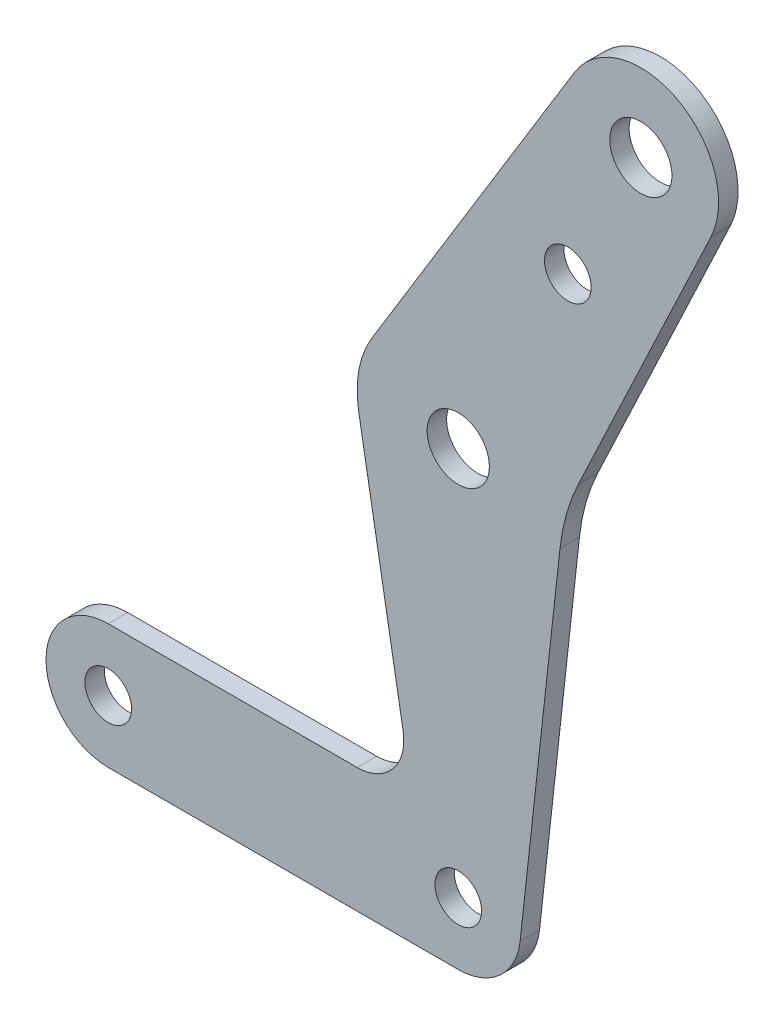
ISO-10303-21;
HEADER;
FILE_DESCRIPTION(('STEP AP214'),'2;1');
FILE_NAME('part.step','',(''),(''),'','','');
FILE_SCHEMA(('AUTOMOTIVE_DESIGN { 1 0 10303 214 1 1 1 1 }'));
ENDSEC;
DATA;
#1=APPLICATION_CONTEXT('core data for automotive mechanical design processes');
#2=APPLICATION_PROTOCOL_DEFINITION('international standard','automotive_design',2000,#1);
#3=PRODUCT_CONTEXT('',#1,'mechanical');
#4=PRODUCT('Part','Part','',(#3));
#5=PRODUCT_RELATED_PRODUCT_CATEGORY('part','',(#4));
#6=PRODUCT_DEFINITION_FORMATION('','',#4);
#7=PRODUCT_DEFINITION_CONTEXT('part definition',#1,'design');
#8=PRODUCT_DEFINITION('design','',#6,#7);
#9=PRODUCT_DEFINITION_SHAPE('','',#8);
#10=(LENGTH_UNIT() NAMED_UNIT(*) SI_UNIT(.MILLI.,.METRE.));
#11=(NAMED_UNIT(*) PLANE_ANGLE_UNIT() SI_UNIT($,.RADIAN.));
#12=(NAMED_UNIT(*) SI_UNIT($,.STERADIAN.) SOLID_ANGLE_UNIT());
#13=UNCERTAINTY_MEASURE_WITH_UNIT(LENGTH_MEASURE(1.E-05),#10,'distance_accuracy_value','');
#14=(GEOMETRIC_REPRESENTATION_CONTEXT(3) GLOBAL_UNCERTAINTY_ASSIGNED_CONTEXT((#13)) GLOBAL_UNIT_ASSIGNED_CONTEXT((#10,
#11,#12)) REPRESENTATION_CONTEXT('',''));
#15=CARTESIAN_POINT('',(0.,0.,0.));
#16=DIRECTION('',(0.,0.,1.));
#17=DIRECTION('',(1.,0.,0.));
#18=AXIS2_PLACEMENT_3D('',#15,#16,#17);
#19=CARTESIAN_POINT('',(0.,0.,2.5));
#20=DIRECTION('',(0.,0.,1.));
#21=DIRECTION('',(1.,0.,0.));
#22=AXIS2_PLACEMENT_3D('',#19,#20,#21);
#23=PLANE('',#22);
#24=CARTESIAN_POINT('',(59.0841468835764,76.488427785768,2.5));
#25=DIRECTION('',(0.,0.,1.));
#26=DIRECTION('',(1.,0.,0.));
#27=AXIS2_PLACEMENT_3D('',#24,#25,#26);
#28=CIRCLE('',#27,3.00000000000001);
#29=CARTESIAN_POINT('',(62.0841468835764,76.488427785768,2.5));
#30=VERTEX_POINT('',#29);
#31=EDGE_CURVE('E298',#30,#30,#28,.T.);
#32=ORIENTED_EDGE('',*,*,#31,.F.);
#33=EDGE_LOOP('',(#32));
#34=FACE_BOUND('',#33,.T.);
#35=CARTESIAN_POINT('',(45.,0.,2.5));
#36=DIRECTION('',(0.,0.,1.));
#37=DIRECTION('',(1.,0.,0.));
#38=AXIS2_PLACEMENT_3D('',#35,#36,#37);
#39=CIRCLE('',#38,2.99999999999999);
#40=CARTESIAN_POINT('',(48.,0.,2.5));
#41=VERTEX_POINT('',#40);
#42=EDGE_CURVE('E310',#41,#41,#39,.T.);
#43=ORIENTED_EDGE('',*,*,#42,.F.);
#44=EDGE_LOOP('',(#43));
#45=FACE_BOUND('',#44,.T.);
#46=CARTESIAN_POINT('',(0.,0.,2.5));
#47=DIRECTION('',(0.,0.,1.));
#48=DIRECTION('',(1.,0.,0.));
#49=AXIS2_PLACEMENT_3D('',#46,#47,#48);
#50=CIRCLE('',#49,8.);
#51=CARTESIAN_POINT('',(0.,8.,2.5));
#52=VERTEX_POINT('',#51);
#53=CARTESIAN_POINT('',(0.,-8.,2.5));
#54=VERTEX_POINT('',#53);
#55=EDGE_CURVE('E180',#52,#54,#50,.T.);
#56=ORIENTED_EDGE('',*,*,#55,.T.);
#57=DIRECTION('',(1.,0.,0.));
#58=VECTOR('',#57,1.);
#59=CARTESIAN_POINT('',(0.,-8.,2.5));
#60=LINE('',#59,#58);
#61=CARTESIAN_POINT('',(45.,-8.,2.5));
#62=VERTEX_POINT('',#61);
#63=EDGE_CURVE('E108',#54,#62,#60,.T.);
#64=ORIENTED_EDGE('',*,*,#63,.T.);
#65=CARTESIAN_POINT('',(45.,0.,2.5));
#66=DIRECTION('',(0.,0.,1.));
#67=DIRECTION('',(1.,0.,0.));
#68=AXIS2_PLACEMENT_3D('',#65,#66,#67);
#69=CIRCLE('',#68,8.);
#70=CARTESIAN_POINT('',(52.9514150947762,-0.88033970180009,2.5));
#71=VERTEX_POINT('',#70);
#72=EDGE_CURVE('E207',#62,#71,#69,.T.);
#73=ORIENTED_EDGE('',*,*,#72,.T.);
#74=DIRECTION('',(0.110042462725011,0.993926886847023,0.));
#75=VECTOR('',#74,1.);
#76=CARTESIAN_POINT('',(58.0819388246756,45.4596399067692,2.5));
#77=LINE('',#76,#75);
#78=CARTESIAN_POINT('',(58.0819388246757,45.4596399067691,2.5));
#79=VERTEX_POINT('',#78);
#80=EDGE_CURVE('E226',#71,#79,#77,.T.);
#81=ORIENTED_EDGE('',*,*,#80,.T.);
#82=CARTESIAN_POINT('',(83.9240378826983,42.5985358759189,2.5));
#83=DIRECTION('',(0.,0.,-1.));
#84=DIRECTION('',(1.,0.,0.));
#85=AXIS2_PLACEMENT_3D('',#82,#83,#84);
#86=CIRCLE('',#85,26.);
#87=CARTESIAN_POINT('',(60.4183652868642,53.7108423789567,2.5));
#88=VERTEX_POINT('',#87);
#89=EDGE_CURVE('E223',#79,#88,#86,.T.);
#90=ORIENTED_EDGE('',*,*,#89,.T.);
#91=DIRECTION('',(0.427396403962993,0.904064330609002,0.));
#92=VECTOR('',#91,1.);
#93=CARTESIAN_POINT('',(77.514221445384,89.8734156033167,2.5));
#94=LINE('',#93,#92);
#95=CARTESIAN_POINT('',(77.514221445384,89.8734156033167,2.5));
#96=VERTEX_POINT('',#95);
#97=EDGE_CURVE('E225',#88,#96,#94,.T.);
#98=ORIENTED_EDGE('',*,*,#97,.T.);
#99=CARTESIAN_POINT('',(68.4735781392939,94.1473796429467,2.5));
#100=DIRECTION('',(0.,0.,1.));
#101=DIRECTION('',(1.,0.,0.));
#102=AXIS2_PLACEMENT_3D('',#99,#100,#101);
#103=CIRCLE('',#102,9.99999999999999);
#104=CARTESIAN_POINT('',(59.9416925346034,99.3634057192307,2.5));
#105=VERTEX_POINT('',#104);
#106=EDGE_CURVE('E228',#96,#105,#103,.T.);
#107=ORIENTED_EDGE('',*,*,#106,.T.);
#108=DIRECTION('',(-0.521602607628401,-0.853188560469051,0.));
#109=VECTOR('',#108,1.);
#110=CARTESIAN_POINT('',(59.9416925346034,99.3634057192307,2.5));
#111=LINE('',#110,#109);
#112=CARTESIAN_POINT('',(33.9085487139023,56.7808338991692,2.5));
#113=VERTEX_POINT('',#112);
#114=EDGE_CURVE('E234',#105,#113,#111,.T.);
#115=ORIENTED_EDGE('',*,*,#114,.T.);
#116=CARTESIAN_POINT('',(45.,50.,2.5));
#117=DIRECTION('',(0.,0.,1.));
#118=DIRECTION('',(1.,0.,0.));
#119=AXIS2_PLACEMENT_3D('',#116,#117,#118);
#120=CIRCLE('',#119,13.);
#121=CARTESIAN_POINT('',(32.1938567430835,47.7633295094421,2.5));
#122=VERTEX_POINT('',#121);
#123=EDGE_CURVE('E139',#113,#122,#120,.T.);
#124=ORIENTED_EDGE('',*,*,#123,.T.);
#125=DIRECTION('',(0.172051576196764,-0.985087942839729,0.));
#126=VECTOR('',#125,1.);
#127=CARTESIAN_POINT('',(32.1938567430835,47.7633295094421,2.5));
#128=LINE('',#127,#126);
#129=CARTESIAN_POINT('',(37.9105276570384,15.0323094571806,2.5));
#130=VERTEX_POINT('',#129);
#131=EDGE_CURVE('E133',#122,#130,#128,.T.);
#132=ORIENTED_EDGE('',*,*,#131,.T.);
#133=CARTESIAN_POINT('',(32.,14.,2.5));
#134=DIRECTION('',(0.,0.,-1.));
#135=DIRECTION('',(-1.,0.,0.));
#136=AXIS2_PLACEMENT_3D('',#133,#134,#135);
#137=CIRCLE('',#136,5.99999999999999);
#138=CARTESIAN_POINT('',(32.,8.,2.5));
#139=VERTEX_POINT('',#138);
#140=EDGE_CURVE('E137',#130,#139,#137,.T.);
#141=ORIENTED_EDGE('',*,*,#140,.T.);
#142=DIRECTION('',(-1.,0.,0.));
#143=VECTOR('',#142,1.);
#144=CARTESIAN_POINT('',(0.,8.,2.5));
#145=LINE('',#144,#143);
#146=EDGE_CURVE('E53',#139,#52,#145,.T.);
#147=ORIENTED_EDGE('',*,*,#146,.T.);
#148=EDGE_LOOP('',(#56,#64,#73,#81,#90,#98,#107,#115,#124,#132,#141,#147));
#149=FACE_BOUND('',#148,.T.);
#150=CARTESIAN_POINT('',(0.,0.,2.5));
#151=DIRECTION('',(0.,0.,1.));
#152=DIRECTION('',(1.,0.,0.));
#153=AXIS2_PLACEMENT_3D('',#150,#151,#152);
#154=CIRCLE('',#153,3.);
#155=CARTESIAN_POINT('',(3.,0.,2.5));
#156=VERTEX_POINT('',#155);
#157=EDGE_CURVE('E161',#156,#156,#154,.T.);
#158=ORIENTED_EDGE('',*,*,#157,.F.);
#159=EDGE_LOOP('',(#158));
#160=FACE_BOUND('',#159,.T.);
#161=CARTESIAN_POINT('',(45.,50.,2.5));
#162=DIRECTION('',(0.,0.,1.));
#163=DIRECTION('',(1.,0.,0.));
#164=AXIS2_PLACEMENT_3D('',#161,#162,#163);
#165=CIRCLE('',#164,4.00000000000001);
#166=CARTESIAN_POINT('',(49.,50.,2.5));
#167=VERTEX_POINT('',#166);
#168=EDGE_CURVE('E304',#167,#167,#165,.T.);
#169=ORIENTED_EDGE('',*,*,#168,.F.);
#170=EDGE_LOOP('',(#169));
#171=FACE_BOUND('',#170,.T.);
#172=CARTESIAN_POINT('',(68.4735781392939,94.1473796429467,2.5));
#173=DIRECTION('',(0.,0.,1.));
#174=DIRECTION('',(1.,0.,0.));
#175=AXIS2_PLACEMENT_3D('',#172,#173,#174);
#176=CIRCLE('',#175,4.00000000000001);
#177=CARTESIAN_POINT('',(72.4735781392939,94.1473796429467,2.5));
#178=VERTEX_POINT('',#177);
#179=EDGE_CURVE('E289',#178,#178,#176,.T.);
#180=ORIENTED_EDGE('',*,*,#179,.F.);
#181=EDGE_LOOP('',(#180));
#182=FACE_BOUND('',#181,.T.);
#183=ADVANCED_FACE('F36',(#34,#45,#149,#160,#171,#182),#23,.T.);
#184=CARTESIAN_POINT('',(0.,0.,0.));
#185=DIRECTION('',(0.,0.,1.));
#186=DIRECTION('',(1.,0.,0.));
#187=AXIS2_PLACEMENT_3D('',#184,#185,#186);
#188=PLANE('',#187);
#189=CARTESIAN_POINT('',(0.,0.,0.));
#190=DIRECTION('',(0.,0.,1.));
#191=DIRECTION('',(1.,0.,0.));
#192=AXIS2_PLACEMENT_3D('',#189,#190,#191);
#193=CIRCLE('',#192,8.);
#194=CARTESIAN_POINT('',(0.,8.,0.));
#195=VERTEX_POINT('',#194);
#196=CARTESIAN_POINT('',(0.,-8.,0.));
#197=VERTEX_POINT('',#196);
#198=EDGE_CURVE('E157',#195,#197,#193,.T.);
#199=ORIENTED_EDGE('',*,*,#198,.F.);
#200=DIRECTION('',(-1.,0.,0.));
#201=VECTOR('',#200,1.);
#202=CARTESIAN_POINT('',(0.,8.,0.));
#203=LINE('',#202,#201);
#204=CARTESIAN_POINT('',(32.,8.,0.));
#205=VERTEX_POINT('',#204);
#206=EDGE_CURVE('E100',#205,#195,#203,.T.);
#207=ORIENTED_EDGE('',*,*,#206,.F.);
#208=CARTESIAN_POINT('',(32.,14.,0.));
#209=DIRECTION('',(0.,0.,-1.));
#210=DIRECTION('',(-1.,0.,0.));
#211=AXIS2_PLACEMENT_3D('',#208,#209,#210);
#212=CIRCLE('',#211,5.99999999999999);
#213=CARTESIAN_POINT('',(37.9105276570384,15.0323094571806,0.));
#214=VERTEX_POINT('',#213);
#215=EDGE_CURVE('E94',#214,#205,#212,.T.);
#216=ORIENTED_EDGE('',*,*,#215,.F.);
#217=DIRECTION('',(0.172051576196764,-0.985087942839729,0.));
#218=VECTOR('',#217,1.);
#219=CARTESIAN_POINT('',(32.1938567430835,47.7633295094421,0.));
#220=LINE('',#219,#218);
#221=CARTESIAN_POINT('',(32.1938567430835,47.7633295094421,0.));
#222=VERTEX_POINT('',#221);
#223=EDGE_CURVE('E147',#222,#214,#220,.T.);
#224=ORIENTED_EDGE('',*,*,#223,.F.);
#225=CARTESIAN_POINT('',(45.,50.,0.));
#226=DIRECTION('',(0.,0.,1.));
#227=DIRECTION('',(1.,0.,0.));
#228=AXIS2_PLACEMENT_3D('',#225,#226,#227);
#229=CIRCLE('',#228,13.);
#230=CARTESIAN_POINT('',(33.9085487139023,56.7808338991692,0.));
#231=VERTEX_POINT('',#230);
#232=EDGE_CURVE('E175',#231,#222,#229,.T.);
#233=ORIENTED_EDGE('',*,*,#232,.F.);
#234=DIRECTION('',(-0.521602607628401,-0.853188560469051,0.));
#235=VECTOR('',#234,1.);
#236=CARTESIAN_POINT('',(59.9416925346034,99.3634057192307,0.));
#237=LINE('',#236,#235);
#238=CARTESIAN_POINT('',(59.9416925346034,99.3634057192307,0.));
#239=VERTEX_POINT('',#238);
#240=EDGE_CURVE('E173',#239,#231,#237,.T.);
#241=ORIENTED_EDGE('',*,*,#240,.F.);
#242=CARTESIAN_POINT('',(68.4735781392939,94.1473796429467,0.));
#243=DIRECTION('',(0.,0.,1.));
#244=DIRECTION('',(1.,0.,0.));
#245=AXIS2_PLACEMENT_3D('',#242,#243,#244);
#246=CIRCLE('',#245,9.99999999999999);
#247=CARTESIAN_POINT('',(77.514221445384,89.8734156033167,0.));
#248=VERTEX_POINT('',#247);
#249=EDGE_CURVE('E171',#248,#239,#246,.T.);
#250=ORIENTED_EDGE('',*,*,#249,.F.);
#251=DIRECTION('',(0.427396403962993,0.904064330609002,0.));
#252=VECTOR('',#251,1.);
#253=CARTESIAN_POINT('',(77.514221445384,89.8734156033167,0.));
#254=LINE('',#253,#252);
#255=CARTESIAN_POINT('',(60.4183652868642,53.7108423789567,0.));
#256=VERTEX_POINT('',#255);
#257=EDGE_CURVE('E169',#256,#248,#254,.T.);
#258=ORIENTED_EDGE('',*,*,#257,.F.);
#259=CARTESIAN_POINT('',(83.9240378826983,42.5985358759189,0.));
#260=DIRECTION('',(0.,0.,-1.));
#261=DIRECTION('',(1.,0.,0.));
#262=AXIS2_PLACEMENT_3D('',#259,#260,#261);
#263=CIRCLE('',#262,26.);
#264=CARTESIAN_POINT('',(58.0819388246757,45.4596399067691,0.));
#265=VERTEX_POINT('',#264);
#266=EDGE_CURVE('E167',#265,#256,#263,.T.);
#267=ORIENTED_EDGE('',*,*,#266,.F.);
#268=DIRECTION('',(0.110042462725011,0.993926886847023,0.));
#269=VECTOR('',#268,1.);
#270=CARTESIAN_POINT('',(58.0819388246756,45.4596399067692,0.));
#271=LINE('',#270,#269);
#272=CARTESIAN_POINT('',(52.9514150947762,-0.88033970180009,0.));
#273=VERTEX_POINT('',#272);
#274=EDGE_CURVE('E165',#273,#265,#271,.T.);
#275=ORIENTED_EDGE('',*,*,#274,.F.);
#276=CARTESIAN_POINT('',(45.,0.,0.));
#277=DIRECTION('',(0.,0.,1.));
#278=DIRECTION('',(1.,0.,0.));
#279=AXIS2_PLACEMENT_3D('',#276,#277,#278);
#280=CIRCLE('',#279,8.);
#281=CARTESIAN_POINT('',(45.,-8.,0.));
#282=VERTEX_POINT('',#281);
#283=EDGE_CURVE('E163',#282,#273,#280,.T.);
#284=ORIENTED_EDGE('',*,*,#283,.F.);
#285=DIRECTION('',(1.,0.,0.));
#286=VECTOR('',#285,1.);
#287=CARTESIAN_POINT('',(0.,-8.,0.));
#288=LINE('',#287,#286);
#289=EDGE_CURVE('E160',#197,#282,#288,.T.);
#290=ORIENTED_EDGE('',*,*,#289,.F.);
#291=EDGE_LOOP('',(#199,#207,#216,#224,#233,#241,#250,#258,#267,#275,#284,#290));
#292=FACE_BOUND('',#291,.T.);
#293=CARTESIAN_POINT('',(0.,0.,0.));
#294=DIRECTION('',(0.,0.,1.));
#295=DIRECTION('',(1.,0.,0.));
#296=AXIS2_PLACEMENT_3D('',#293,#294,#295);
#297=CIRCLE('',#296,3.);
#298=CARTESIAN_POINT('',(3.,0.,0.));
#299=VERTEX_POINT('',#298);
#300=EDGE_CURVE('E313',#299,#299,#297,.T.);
#301=ORIENTED_EDGE('',*,*,#300,.T.);
#302=EDGE_LOOP('',(#301));
#303=FACE_BOUND('',#302,.T.);
#304=CARTESIAN_POINT('',(45.,0.,0.));
#305=DIRECTION('',(0.,0.,1.));
#306=DIRECTION('',(1.,0.,0.));
#307=AXIS2_PLACEMENT_3D('',#304,#305,#306);
#308=CIRCLE('',#307,2.99999999999999);
#309=CARTESIAN_POINT('',(48.,0.,0.));
#310=VERTEX_POINT('',#309);
#311=EDGE_CURVE('E307',#310,#310,#308,.T.);
#312=ORIENTED_EDGE('',*,*,#311,.T.);
#313=EDGE_LOOP('',(#312));
#314=FACE_BOUND('',#313,.T.);
#315=CARTESIAN_POINT('',(45.,50.,0.));
#316=DIRECTION('',(0.,0.,1.));
#317=DIRECTION('',(1.,0.,0.));
#318=AXIS2_PLACEMENT_3D('',#315,#316,#317);
#319=CIRCLE('',#318,4.00000000000001);
#320=CARTESIAN_POINT('',(49.,50.,0.));
#321=VERTEX_POINT('',#320);
#322=EDGE_CURVE('E301',#321,#321,#319,.T.);
#323=ORIENTED_EDGE('',*,*,#322,.T.);
#324=EDGE_LOOP('',(#323));
#325=FACE_BOUND('',#324,.T.);
#326=CARTESIAN_POINT('',(59.0841468835764,76.488427785768,0.));
#327=DIRECTION('',(0.,0.,1.));
#328=DIRECTION('',(1.,0.,0.));
#329=AXIS2_PLACEMENT_3D('',#326,#327,#328);
#330=CIRCLE('',#329,3.00000000000001);
#331=CARTESIAN_POINT('',(62.0841468835764,76.488427785768,0.));
#332=VERTEX_POINT('',#331);
#333=EDGE_CURVE('E295',#332,#332,#330,.T.);
#334=ORIENTED_EDGE('',*,*,#333,.T.);
#335=EDGE_LOOP('',(#334));
#336=FACE_BOUND('',#335,.T.);
#337=CARTESIAN_POINT('',(68.4735781392939,94.1473796429467,0.));
#338=DIRECTION('',(0.,0.,1.));
#339=DIRECTION('',(1.,0.,0.));
#340=AXIS2_PLACEMENT_3D('',#337,#338,#339);
#341=CIRCLE('',#340,4.00000000000001);
#342=CARTESIAN_POINT('',(72.4735781392939,94.1473796429467,0.));
#343=VERTEX_POINT('',#342);
#344=EDGE_CURVE('E292',#343,#343,#341,.T.);
#345=ORIENTED_EDGE('',*,*,#344,.T.);
#346=EDGE_LOOP('',(#345));
#347=FACE_BOUND('',#346,.T.);
#348=ADVANCED_FACE('F211',(#292,#303,#314,#325,#336,#347),#188,.F.);
#349=CARTESIAN_POINT('',(0.,0.,2.5));
#350=DIRECTION('',(0.,0.,-1.));
#351=DIRECTION('',(-1.,0.,0.));
#352=AXIS2_PLACEMENT_3D('',#349,#350,#351);
#353=CYLINDRICAL_SURFACE('',#352,8.);
#354=ORIENTED_EDGE('',*,*,#198,.T.);
#355=DIRECTION('',(0.,0.,-1.));
#356=VECTOR('',#355,1.);
#357=CARTESIAN_POINT('',(0.,-8.,2.5));
#358=LINE('',#357,#356);
#359=EDGE_CURVE('E11',#54,#197,#358,.T.);
#360=ORIENTED_EDGE('',*,*,#359,.F.);
#361=ORIENTED_EDGE('',*,*,#55,.F.);
#362=DIRECTION('',(0.,0.,-1.));
#363=VECTOR('',#362,1.);
#364=CARTESIAN_POINT('',(0.,8.,2.5));
#365=LINE('',#364,#363);
#366=EDGE_CURVE('E153',#52,#195,#365,.T.);
#367=ORIENTED_EDGE('',*,*,#366,.T.);
#368=EDGE_LOOP('',(#354,#360,#361,#367));
#369=FACE_BOUND('',#368,.T.);
#370=ADVANCED_FACE('F38',(#369),#353,.T.);
#371=CARTESIAN_POINT('',(0.,-8.,2.5));
#372=DIRECTION('',(0.,1.,0.));
#373=DIRECTION('',(0.,0.,1.));
#374=AXIS2_PLACEMENT_3D('',#371,#372,#373);
#375=PLANE('',#374);
#376=ORIENTED_EDGE('',*,*,#289,.T.);
#377=DIRECTION('',(0.,0.,-1.));
#378=VECTOR('',#377,1.);
#379=CARTESIAN_POINT('',(45.,-8.,2.5));
#380=LINE('',#379,#378);
#381=EDGE_CURVE('E45',#62,#282,#380,.T.);
#382=ORIENTED_EDGE('',*,*,#381,.F.);
#383=ORIENTED_EDGE('',*,*,#63,.F.);
#384=ORIENTED_EDGE('',*,*,#359,.T.);
#385=EDGE_LOOP('',(#376,#382,#383,#384));
#386=FACE_BOUND('',#385,.T.);
#387=ADVANCED_FACE('F432',(#386),#375,.F.);
#388=CARTESIAN_POINT('',(45.,0.,2.5));
#389=DIRECTION('',(0.,0.,-1.));
#390=DIRECTION('',(-1.,0.,0.));
#391=AXIS2_PLACEMENT_3D('',#388,#389,#390);
#392=CYLINDRICAL_SURFACE('',#391,8.);
#393=ORIENTED_EDGE('',*,*,#283,.T.);
#394=DIRECTION('',(0.,0.,-1.));
#395=VECTOR('',#394,1.);
#396=CARTESIAN_POINT('',(52.9514150947762,-0.88033970180009,2.5));
#397=LINE('',#396,#395);
#398=EDGE_CURVE('E199',#71,#273,#397,.T.);
#399=ORIENTED_EDGE('',*,*,#398,.F.);
#400=ORIENTED_EDGE('',*,*,#72,.F.);
#401=ORIENTED_EDGE('',*,*,#381,.T.);
#402=EDGE_LOOP('',(#393,#399,#400,#401));
#403=FACE_BOUND('',#402,.T.);
#404=ADVANCED_FACE('F205',(#403),#392,.T.);
#405=CARTESIAN_POINT('',(58.0819388246756,45.4596399067692,2.5));
#406=DIRECTION('',(-0.993926886847023,0.110042462725011,0.));
#407=DIRECTION('',(-0.110042462725011,-0.993926886847023,0.));
#408=AXIS2_PLACEMENT_3D('',#405,#406,#407);
#409=PLANE('',#408);
#410=ORIENTED_EDGE('',*,*,#274,.T.);
#411=DIRECTION('',(0.,0.,-1.));
#412=VECTOR('',#411,1.);
#413=CARTESIAN_POINT('',(58.0819388246757,45.4596399067691,2.5));
#414=LINE('',#413,#412);
#415=EDGE_CURVE('E196',#79,#265,#414,.T.);
#416=ORIENTED_EDGE('',*,*,#415,.F.);
#417=ORIENTED_EDGE('',*,*,#80,.F.);
#418=ORIENTED_EDGE('',*,*,#398,.T.);
#419=EDGE_LOOP('',(#410,#416,#417,#418));
#420=FACE_BOUND('',#419,.T.);
#421=ADVANCED_FACE('F217',(#420),#409,.F.);
#422=CARTESIAN_POINT('',(83.9240378826983,42.5985358759189,2.5));
#423=DIRECTION('',(0.,0.,-1.));
#424=DIRECTION('',(-1.,0.,0.));
#425=AXIS2_PLACEMENT_3D('',#422,#423,#424);
#426=CYLINDRICAL_SURFACE('',#425,26.);
#427=ORIENTED_EDGE('',*,*,#266,.T.);
#428=DIRECTION('',(0.,0.,-1.));
#429=VECTOR('',#428,1.);
#430=CARTESIAN_POINT('',(60.4183652868642,53.7108423789567,2.5));
#431=LINE('',#430,#429);
#432=EDGE_CURVE('E193',#88,#256,#431,.T.);
#433=ORIENTED_EDGE('',*,*,#432,.F.);
#434=ORIENTED_EDGE('',*,*,#89,.F.);
#435=ORIENTED_EDGE('',*,*,#415,.T.);
#436=EDGE_LOOP('',(#427,#433,#434,#435));
#437=FACE_BOUND('',#436,.T.);
#438=ADVANCED_FACE('F221',(#437),#426,.F.);
#439=CARTESIAN_POINT('',(77.514221445384,89.8734156033167,2.5));
#440=DIRECTION('',(-0.904064330609002,0.427396403962993,0.));
#441=DIRECTION('',(-0.427396403962993,-0.904064330609002,0.));
#442=AXIS2_PLACEMENT_3D('',#439,#440,#441);
#443=PLANE('',#442);
#444=ORIENTED_EDGE('',*,*,#257,.T.);
#445=DIRECTION('',(0.,0.,-1.));
#446=VECTOR('',#445,1.);
#447=CARTESIAN_POINT('',(77.514221445384,89.8734156033167,2.5));
#448=LINE('',#447,#446);
#449=EDGE_CURVE('E190',#96,#248,#448,.T.);
#450=ORIENTED_EDGE('',*,*,#449,.F.);
#451=ORIENTED_EDGE('',*,*,#97,.F.);
#452=ORIENTED_EDGE('',*,*,#432,.T.);
#453=EDGE_LOOP('',(#444,#450,#451,#452));
#454=FACE_BOUND('',#453,.T.);
#455=ADVANCED_FACE('F397',(#454),#443,.F.);
#456=CARTESIAN_POINT('',(68.4735781392939,94.1473796429467,2.5));
#457=DIRECTION('',(0.,0.,-1.));
#458=DIRECTION('',(-1.,0.,0.));
#459=AXIS2_PLACEMENT_3D('',#456,#457,#458);
#460=CYLINDRICAL_SURFACE('',#459,9.99999999999999);
#461=ORIENTED_EDGE('',*,*,#249,.T.);
#462=DIRECTION('',(0.,0.,-1.));
#463=VECTOR('',#462,1.);
#464=CARTESIAN_POINT('',(59.9416925346034,99.3634057192307,2.5));
#465=LINE('',#464,#463);
#466=EDGE_CURVE('E187',#105,#239,#465,.T.);
#467=ORIENTED_EDGE('',*,*,#466,.F.);
#468=ORIENTED_EDGE('',*,*,#106,.F.);
#469=ORIENTED_EDGE('',*,*,#449,.T.);
#470=EDGE_LOOP('',(#461,#467,#468,#469));
#471=FACE_BOUND('',#470,.T.);
#472=ADVANCED_FACE('F388',(#471),#460,.T.);
#473=CARTESIAN_POINT('',(59.9416925346034,99.3634057192307,2.5));
#474=DIRECTION('',(0.853188560469051,-0.521602607628401,0.));
#475=DIRECTION('',(0.521602607628401,0.853188560469051,0.));
#476=AXIS2_PLACEMENT_3D('',#473,#474,#475);
#477=PLANE('',#476);
#478=ORIENTED_EDGE('',*,*,#240,.T.);
#479=DIRECTION('',(0.,0.,-1.));
#480=VECTOR('',#479,1.);
#481=CARTESIAN_POINT('',(33.9085487139023,56.7808338991692,2.5));
#482=LINE('',#481,#480);
#483=EDGE_CURVE('E184',#113,#231,#482,.T.);
#484=ORIENTED_EDGE('',*,*,#483,.F.);
#485=ORIENTED_EDGE('',*,*,#114,.F.);
#486=ORIENTED_EDGE('',*,*,#466,.T.);
#487=EDGE_LOOP('',(#478,#484,#485,#486));
#488=FACE_BOUND('',#487,.T.);
#489=ADVANCED_FACE('F240',(#488),#477,.F.);
#490=CARTESIAN_POINT('',(45.,50.,2.5));
#491=DIRECTION('',(0.,0.,-1.));
#492=DIRECTION('',(-1.,0.,0.));
#493=AXIS2_PLACEMENT_3D('',#490,#491,#492);
#494=CYLINDRICAL_SURFACE('',#493,13.);
#495=ORIENTED_EDGE('',*,*,#232,.T.);
#496=DIRECTION('',(0.,0.,-1.));
#497=VECTOR('',#496,1.);
#498=CARTESIAN_POINT('',(32.1938567430835,47.7633295094421,2.5));
#499=LINE('',#498,#497);
#500=EDGE_CURVE('E148',#122,#222,#499,.T.);
#501=ORIENTED_EDGE('',*,*,#500,.F.);
#502=ORIENTED_EDGE('',*,*,#123,.F.);
#503=ORIENTED_EDGE('',*,*,#483,.T.);
#504=EDGE_LOOP('',(#495,#501,#502,#503));
#505=FACE_BOUND('',#504,.T.);
#506=ADVANCED_FACE('F244',(#505),#494,.T.);
#507=CARTESIAN_POINT('',(32.1938567430835,47.7633295094421,2.5));
#508=DIRECTION('',(0.985087942839729,0.172051576196764,0.));
#509=DIRECTION('',(-0.172051576196764,0.985087942839729,0.));
#510=AXIS2_PLACEMENT_3D('',#507,#508,#509);
#511=PLANE('',#510);
#512=ORIENTED_EDGE('',*,*,#223,.T.);
#513=DIRECTION('',(0.,0.,-1.));
#514=VECTOR('',#513,1.);
#515=CARTESIAN_POINT('',(37.9105276570384,15.0323094571806,2.5));
#516=LINE('',#515,#514);
#517=EDGE_CURVE('E144',#130,#214,#516,.T.);
#518=ORIENTED_EDGE('',*,*,#517,.F.);
#519=ORIENTED_EDGE('',*,*,#131,.F.);
#520=ORIENTED_EDGE('',*,*,#500,.T.);
#521=EDGE_LOOP('',(#512,#518,#519,#520));
#522=FACE_BOUND('',#521,.T.);
#523=ADVANCED_FACE('F145',(#522),#511,.F.);
#524=CARTESIAN_POINT('',(32.,14.,2.5));
#525=DIRECTION('',(0.,0.,-1.));
#526=DIRECTION('',(-1.,0.,0.));
#527=AXIS2_PLACEMENT_3D('',#524,#525,#526);
#528=CYLINDRICAL_SURFACE('',#527,5.99999999999999);
#529=ORIENTED_EDGE('',*,*,#215,.T.);
#530=DIRECTION('',(0.,0.,-1.));
#531=VECTOR('',#530,1.);
#532=CARTESIAN_POINT('',(32.,8.,2.5));
#533=LINE('',#532,#531);
#534=EDGE_CURVE('E149',#139,#205,#533,.T.);
#535=ORIENTED_EDGE('',*,*,#534,.F.);
#536=ORIENTED_EDGE('',*,*,#140,.F.);
#537=ORIENTED_EDGE('',*,*,#517,.T.);
#538=EDGE_LOOP('',(#529,#535,#536,#537));
#539=FACE_BOUND('',#538,.T.);
#540=ADVANCED_FACE('F151',(#539),#528,.F.);
#541=CARTESIAN_POINT('',(0.,8.,2.5));
#542=DIRECTION('',(0.,-1.,0.));
#543=DIRECTION('',(1.,0.,0.));
#544=AXIS2_PLACEMENT_3D('',#541,#542,#543);
#545=PLANE('',#544);
#546=ORIENTED_EDGE('',*,*,#206,.T.);
#547=ORIENTED_EDGE('',*,*,#366,.F.);
#548=ORIENTED_EDGE('',*,*,#146,.F.);
#549=ORIENTED_EDGE('',*,*,#534,.T.);
#550=EDGE_LOOP('',(#546,#547,#548,#549));
#551=FACE_BOUND('',#550,.T.);
#552=ADVANCED_FACE('F248',(#551),#545,.F.);
#553=CARTESIAN_POINT('',(0.,0.,2.5));
#554=DIRECTION('',(0.,0.,-1.));
#555=DIRECTION('',(-1.,0.,0.));
#556=AXIS2_PLACEMENT_3D('',#553,#554,#555);
#557=CYLINDRICAL_SURFACE('',#556,3.);
#558=ORIENTED_EDGE('',*,*,#157,.T.);
#559=EDGE_LOOP('',(#558));
#560=FACE_BOUND('',#559,.T.);
#561=ORIENTED_EDGE('',*,*,#300,.F.);
#562=EDGE_LOOP('',(#561));
#563=FACE_BOUND('',#562,.T.);
#564=ADVANCED_FACE('F250',(#560,#563),#557,.F.);
#565=CARTESIAN_POINT('',(45.,0.,2.5));
#566=DIRECTION('',(0.,0.,-1.));
#567=DIRECTION('',(-1.,0.,0.));
#568=AXIS2_PLACEMENT_3D('',#565,#566,#567);
#569=CYLINDRICAL_SURFACE('',#568,2.99999999999999);
#570=ORIENTED_EDGE('',*,*,#42,.T.);
#571=EDGE_LOOP('',(#570));
#572=FACE_BOUND('',#571,.T.);
#573=ORIENTED_EDGE('',*,*,#311,.F.);
#574=EDGE_LOOP('',(#573));
#575=FACE_BOUND('',#574,.T.);
#576=ADVANCED_FACE('F256',(#572,#575),#569,.F.);
#577=CARTESIAN_POINT('',(45.,50.,2.5));
#578=DIRECTION('',(0.,0.,-1.));
#579=DIRECTION('',(-1.,0.,0.));
#580=AXIS2_PLACEMENT_3D('',#577,#578,#579);
#581=CYLINDRICAL_SURFACE('',#580,4.00000000000001);
#582=ORIENTED_EDGE('',*,*,#168,.T.);
#583=EDGE_LOOP('',(#582));
#584=FACE_BOUND('',#583,.T.);
#585=ORIENTED_EDGE('',*,*,#322,.F.);
#586=EDGE_LOOP('',(#585));
#587=FACE_BOUND('',#586,.T.);
#588=ADVANCED_FACE('F272',(#584,#587),#581,.F.);
#589=CARTESIAN_POINT('',(59.0841468835764,76.488427785768,2.5));
#590=DIRECTION('',(0.,0.,-1.));
#591=DIRECTION('',(-1.,0.,0.));
#592=AXIS2_PLACEMENT_3D('',#589,#590,#591);
#593=CYLINDRICAL_SURFACE('',#592,3.00000000000001);
#594=ORIENTED_EDGE('',*,*,#31,.T.);
#595=EDGE_LOOP('',(#594));
#596=FACE_BOUND('',#595,.T.);
#597=ORIENTED_EDGE('',*,*,#333,.F.);
#598=EDGE_LOOP('',(#597));
#599=FACE_BOUND('',#598,.T.);
#600=ADVANCED_FACE('F276',(#596,#599),#593,.F.);
#601=CARTESIAN_POINT('',(68.4735781392939,94.1473796429467,2.5));
#602=DIRECTION('',(0.,0.,-1.));
#603=DIRECTION('',(-1.,0.,0.));
#604=AXIS2_PLACEMENT_3D('',#601,#602,#603);
#605=CYLINDRICAL_SURFACE('',#604,4.00000000000001);
#606=ORIENTED_EDGE('',*,*,#179,.T.);
#607=EDGE_LOOP('',(#606));
#608=FACE_BOUND('',#607,.T.);
#609=ORIENTED_EDGE('',*,*,#344,.F.);
#610=EDGE_LOOP('',(#609));
#611=FACE_BOUND('',#610,.T.);
#612=ADVANCED_FACE('F280',(#608,#611),#605,.F.);
#613=CLOSED_SHELL('',(#183,#348,#370,#387,#404,#421,#438,#455,#472,#489,#506,#523,#540,#552,
#564,#576,#588,#600,#612));
#614=MANIFOLD_SOLID_BREP('B2',#613);
#615=ADVANCED_BREP_SHAPE_REPRESENTATION('',(#18,#614),#14);
#616=SHAPE_DEFINITION_REPRESENTATION(#9,#615);
ENDSEC;
END-ISO-10303-21;
